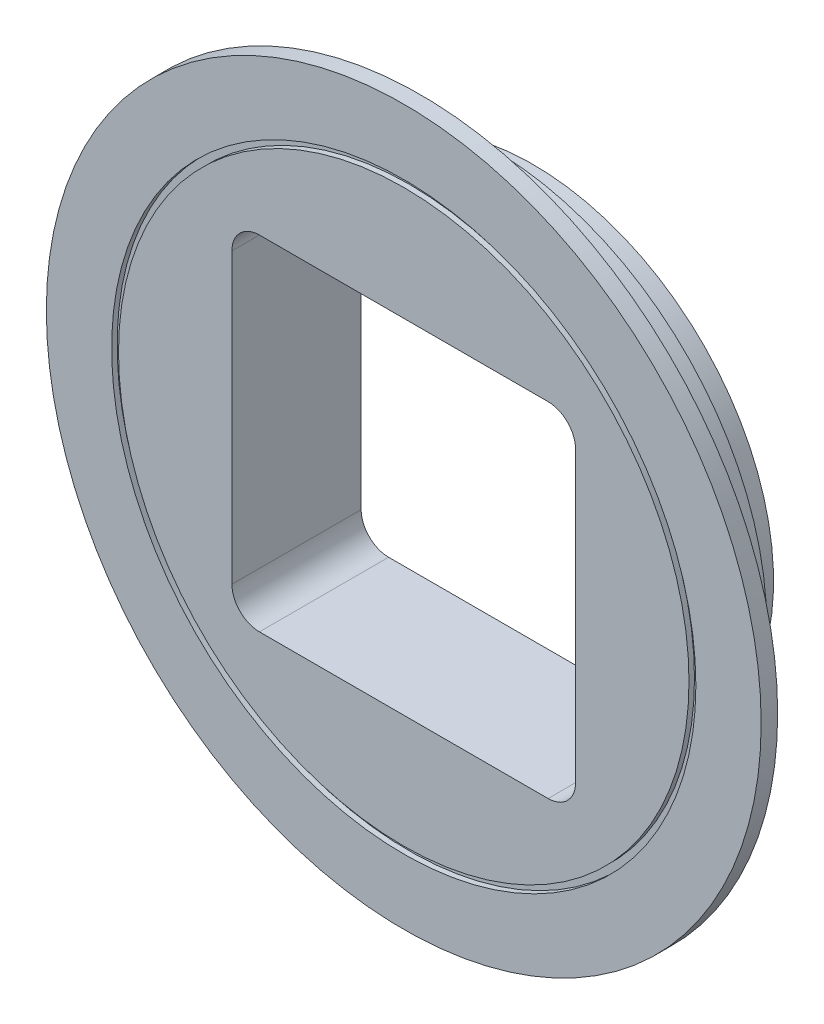
ISO-10303-21;
HEADER;
FILE_DESCRIPTION(('STEP AP214'),'2;1');
FILE_NAME('part.step','',(''),(''),'','','');
FILE_SCHEMA(('AUTOMOTIVE_DESIGN { 1 0 10303 214 1 1 1 1 }'));
ENDSEC;
DATA;
#1=APPLICATION_CONTEXT('core data for automotive mechanical design processes');
#2=APPLICATION_PROTOCOL_DEFINITION('international standard','automotive_design',2000,#1);
#3=PRODUCT_CONTEXT('',#1,'mechanical');
#4=PRODUCT('Part','Part','',(#3));
#5=PRODUCT_RELATED_PRODUCT_CATEGORY('part','',(#4));
#6=PRODUCT_DEFINITION_FORMATION('','',#4);
#7=PRODUCT_DEFINITION_CONTEXT('part definition',#1,'design');
#8=PRODUCT_DEFINITION('design','',#6,#7);
#9=PRODUCT_DEFINITION_SHAPE('','',#8);
#10=(LENGTH_UNIT() NAMED_UNIT(*) SI_UNIT(.MILLI.,.METRE.));
#11=(NAMED_UNIT(*) PLANE_ANGLE_UNIT() SI_UNIT($,.RADIAN.));
#12=(NAMED_UNIT(*) SI_UNIT($,.STERADIAN.) SOLID_ANGLE_UNIT());
#13=UNCERTAINTY_MEASURE_WITH_UNIT(LENGTH_MEASURE(1.E-05),#10,'distance_accuracy_value','');
#14=(GEOMETRIC_REPRESENTATION_CONTEXT(3) GLOBAL_UNCERTAINTY_ASSIGNED_CONTEXT((#13)) GLOBAL_UNIT_ASSIGNED_CONTEXT((#10,
#11,#12)) REPRESENTATION_CONTEXT('',''));
#15=CARTESIAN_POINT('',(0.,0.,0.));
#16=DIRECTION('',(0.,0.,1.));
#17=DIRECTION('',(1.,0.,0.));
#18=AXIS2_PLACEMENT_3D('',#15,#16,#17);
#19=CARTESIAN_POINT('',(0.,0.,7.4));
#20=DIRECTION('',(0.,0.,1.));
#21=DIRECTION('',(1.,0.,0.));
#22=AXIS2_PLACEMENT_3D('',#19,#20,#21);
#23=PLANE('',#22);
#24=DIRECTION('',(1.,0.,0.));
#25=VECTOR('',#24,1.);
#26=CARTESIAN_POINT('',(-10.5,-12.5,7.4));
#27=LINE('',#26,#25);
#28=CARTESIAN_POINT('',(-10.5,-12.5,7.4));
#29=VERTEX_POINT('',#28);
#30=CARTESIAN_POINT('',(10.5,-12.5,7.4));
#31=VERTEX_POINT('',#30);
#32=EDGE_CURVE('E115',#29,#31,#27,.T.);
#33=ORIENTED_EDGE('',*,*,#32,.F.);
#34=CARTESIAN_POINT('',(-10.5,-10.5,7.4));
#35=DIRECTION('',(0.,0.,1.));
#36=DIRECTION('',(1.,0.,0.));
#37=AXIS2_PLACEMENT_3D('',#34,#35,#36);
#38=CIRCLE('',#37,2.);
#39=CARTESIAN_POINT('',(-12.5,-10.5,7.4));
#40=VERTEX_POINT('',#39);
#41=EDGE_CURVE('E125',#40,#29,#38,.T.);
#42=ORIENTED_EDGE('',*,*,#41,.F.);
#43=DIRECTION('',(0.,-1.,0.));
#44=VECTOR('',#43,1.);
#45=CARTESIAN_POINT('',(-12.5,10.5,7.4));
#46=LINE('',#45,#44);
#47=CARTESIAN_POINT('',(-12.5,10.5,7.4));
#48=VERTEX_POINT('',#47);
#49=EDGE_CURVE('E150',#48,#40,#46,.T.);
#50=ORIENTED_EDGE('',*,*,#49,.F.);
#51=CARTESIAN_POINT('',(-10.5,10.5,7.4));
#52=DIRECTION('',(0.,0.,1.));
#53=DIRECTION('',(1.,0.,0.));
#54=AXIS2_PLACEMENT_3D('',#51,#52,#53);
#55=CIRCLE('',#54,2.);
#56=CARTESIAN_POINT('',(-10.5,12.5,7.4));
#57=VERTEX_POINT('',#56);
#58=EDGE_CURVE('E148',#57,#48,#55,.T.);
#59=ORIENTED_EDGE('',*,*,#58,.F.);
#60=DIRECTION('',(-1.,0.,0.));
#61=VECTOR('',#60,1.);
#62=CARTESIAN_POINT('',(10.5,12.5,7.4));
#63=LINE('',#62,#61);
#64=CARTESIAN_POINT('',(10.5,12.5,7.4));
#65=VERTEX_POINT('',#64);
#66=EDGE_CURVE('E145',#65,#57,#63,.T.);
#67=ORIENTED_EDGE('',*,*,#66,.F.);
#68=CARTESIAN_POINT('',(10.5,10.5,7.4));
#69=DIRECTION('',(0.,0.,1.));
#70=DIRECTION('',(1.,0.,0.));
#71=AXIS2_PLACEMENT_3D('',#68,#69,#70);
#72=CIRCLE('',#71,2.);
#73=CARTESIAN_POINT('',(12.5,10.5,7.4));
#74=VERTEX_POINT('',#73);
#75=EDGE_CURVE('E142',#74,#65,#72,.T.);
#76=ORIENTED_EDGE('',*,*,#75,.F.);
#77=DIRECTION('',(0.,1.,0.));
#78=VECTOR('',#77,1.);
#79=CARTESIAN_POINT('',(12.5,-10.5,7.4));
#80=LINE('',#79,#78);
#81=CARTESIAN_POINT('',(12.5,-10.5,7.4));
#82=VERTEX_POINT('',#81);
#83=EDGE_CURVE('E136',#82,#74,#80,.T.);
#84=ORIENTED_EDGE('',*,*,#83,.F.);
#85=CARTESIAN_POINT('',(10.5,-10.5,7.4));
#86=DIRECTION('',(0.,0.,1.));
#87=DIRECTION('',(1.,0.,0.));
#88=AXIS2_PLACEMENT_3D('',#85,#86,#87);
#89=CIRCLE('',#88,2.);
#90=EDGE_CURVE('E134',#31,#82,#89,.T.);
#91=ORIENTED_EDGE('',*,*,#90,.F.);
#92=EDGE_LOOP('',(#33,#42,#50,#59,#67,#76,#84,#91));
#93=FACE_BOUND('',#92,.T.);
#94=CARTESIAN_POINT('',(0.,0.,7.4));
#95=DIRECTION('',(0.,0.,1.));
#96=DIRECTION('',(1.,0.,0.));
#97=AXIS2_PLACEMENT_3D('',#94,#95,#96);
#98=CIRCLE('',#97,20.75);
#99=CARTESIAN_POINT('',(20.75,0.,7.4));
#100=VERTEX_POINT('',#99);
#101=EDGE_CURVE('E255',#100,#100,#98,.T.);
#102=ORIENTED_EDGE('',*,*,#101,.T.);
#103=EDGE_LOOP('',(#102));
#104=FACE_BOUND('',#103,.T.);
#105=ADVANCED_FACE('F43',(#93,#104),#23,.T.);
#106=CARTESIAN_POINT('',(0.,0.,7.001));
#107=DIRECTION('',(0.,0.,-1.));
#108=DIRECTION('',(-1.,0.,0.));
#109=AXIS2_PLACEMENT_3D('',#106,#107,#108);
#110=CYLINDRICAL_SURFACE('',#109,22.5);
#111=CARTESIAN_POINT('',(0.,0.,5.));
#112=DIRECTION('',(0.,0.,-1.));
#113=DIRECTION('',(-1.,0.,0.));
#114=AXIS2_PLACEMENT_3D('',#111,#112,#113);
#115=CIRCLE('',#114,22.5);
#116=CARTESIAN_POINT('',(-22.5,0.,5.));
#117=VERTEX_POINT('',#116);
#118=EDGE_CURVE('E158',#117,#117,#115,.T.);
#119=ORIENTED_EDGE('',*,*,#118,.F.);
#120=EDGE_LOOP('',(#119));
#121=FACE_BOUND('',#120,.T.);
#122=CARTESIAN_POINT('',(0.,0.,6.2));
#123=DIRECTION('',(0.,0.,1.));
#124=DIRECTION('',(1.,0.,0.));
#125=AXIS2_PLACEMENT_3D('',#122,#123,#124);
#126=CIRCLE('',#125,22.5);
#127=CARTESIAN_POINT('',(22.5,0.,6.2));
#128=VERTEX_POINT('',#127);
#129=EDGE_CURVE('E48',#128,#128,#126,.F.);
#130=ORIENTED_EDGE('',*,*,#129,.T.);
#131=EDGE_LOOP('',(#130));
#132=FACE_BOUND('',#131,.T.);
#133=ADVANCED_FACE('F221',(#121,#132),#110,.T.);
#134=CARTESIAN_POINT('',(0.,0.,5.));
#135=DIRECTION('',(0.,0.,1.));
#136=DIRECTION('',(1.,0.,0.));
#137=AXIS2_PLACEMENT_3D('',#134,#135,#136);
#138=PLANE('',#137);
#139=CARTESIAN_POINT('',(0.,0.,5.));
#140=DIRECTION('',(0.,0.,1.));
#141=DIRECTION('',(1.,0.,0.));
#142=AXIS2_PLACEMENT_3D('',#139,#140,#141);
#143=CIRCLE('',#142,20.);
#144=CARTESIAN_POINT('',(20.,0.,5.));
#145=VERTEX_POINT('',#144);
#146=EDGE_CURVE('E196',#145,#145,#143,.F.);
#147=ORIENTED_EDGE('',*,*,#146,.F.);
#148=EDGE_LOOP('',(#147));
#149=FACE_BOUND('',#148,.T.);
#150=ORIENTED_EDGE('',*,*,#118,.T.);
#151=EDGE_LOOP('',(#150));
#152=FACE_BOUND('',#151,.T.);
#153=ADVANCED_FACE('F229',(#149,#152),#138,.F.);
#154=CARTESIAN_POINT('',(-12.5,12.5,7.));
#155=DIRECTION('',(1.,0.,0.));
#156=DIRECTION('',(0.,1.,0.));
#157=AXIS2_PLACEMENT_3D('',#154,#155,#156);
#158=PLANE('',#157);
#159=DIRECTION('',(0.,0.,-1.));
#160=VECTOR('',#159,1.);
#161=CARTESIAN_POINT('',(-12.5,-10.5,5.));
#162=LINE('',#161,#160);
#163=CARTESIAN_POINT('',(-12.5,-10.5,-2.));
#164=VERTEX_POINT('',#163);
#165=EDGE_CURVE('E60',#40,#164,#162,.T.);
#166=ORIENTED_EDGE('',*,*,#165,.T.);
#167=DIRECTION('',(0.,1.,0.));
#168=VECTOR('',#167,1.);
#169=CARTESIAN_POINT('',(-12.5,10.5,-2.));
#170=LINE('',#169,#168);
#171=CARTESIAN_POINT('',(-12.5,10.5,-2.));
#172=VERTEX_POINT('',#171);
#173=EDGE_CURVE('E178',#164,#172,#170,.T.);
#174=ORIENTED_EDGE('',*,*,#173,.T.);
#175=DIRECTION('',(0.,0.,-1.));
#176=VECTOR('',#175,1.);
#177=CARTESIAN_POINT('',(-12.5,10.5,7.));
#178=LINE('',#177,#176);
#179=EDGE_CURVE('E68',#172,#48,#178,.F.);
#180=ORIENTED_EDGE('',*,*,#179,.T.);
#181=ORIENTED_EDGE('',*,*,#49,.T.);
#182=EDGE_LOOP('',(#166,#174,#180,#181));
#183=FACE_BOUND('',#182,.T.);
#184=ADVANCED_FACE('F375',(#183),#158,.T.);
#185=CARTESIAN_POINT('',(-12.5,-12.5,7.));
#186=DIRECTION('',(0.,1.,0.));
#187=DIRECTION('',(0.,0.,1.));
#188=AXIS2_PLACEMENT_3D('',#185,#186,#187);
#189=PLANE('',#188);
#190=DIRECTION('',(0.,0.,-1.));
#191=VECTOR('',#190,1.);
#192=CARTESIAN_POINT('',(10.5,-12.5,5.));
#193=LINE('',#192,#191);
#194=CARTESIAN_POINT('',(10.5,-12.5,-2.));
#195=VERTEX_POINT('',#194);
#196=EDGE_CURVE('E121',#31,#195,#193,.T.);
#197=ORIENTED_EDGE('',*,*,#196,.T.);
#198=DIRECTION('',(-1.,0.,0.));
#199=VECTOR('',#198,1.);
#200=CARTESIAN_POINT('',(-10.5,-12.5,-2.));
#201=LINE('',#200,#199);
#202=CARTESIAN_POINT('',(-10.5,-12.5,-2.));
#203=VERTEX_POINT('',#202);
#204=EDGE_CURVE('E118',#195,#203,#201,.T.);
#205=ORIENTED_EDGE('',*,*,#204,.T.);
#206=DIRECTION('',(0.,0.,-1.));
#207=VECTOR('',#206,1.);
#208=CARTESIAN_POINT('',(-10.5,-12.5,7.));
#209=LINE('',#208,#207);
#210=EDGE_CURVE('E111',#203,#29,#209,.F.);
#211=ORIENTED_EDGE('',*,*,#210,.T.);
#212=ORIENTED_EDGE('',*,*,#32,.T.);
#213=EDGE_LOOP('',(#197,#205,#211,#212));
#214=FACE_BOUND('',#213,.T.);
#215=ADVANCED_FACE('F113',(#214),#189,.T.);
#216=CARTESIAN_POINT('',(12.5,12.5,7.));
#217=DIRECTION('',(-1.,0.,0.));
#218=DIRECTION('',(0.,-1.,0.));
#219=AXIS2_PLACEMENT_3D('',#216,#217,#218);
#220=PLANE('',#219);
#221=DIRECTION('',(0.,0.,-1.));
#222=VECTOR('',#221,1.);
#223=CARTESIAN_POINT('',(12.5,10.5,5.));
#224=LINE('',#223,#222);
#225=CARTESIAN_POINT('',(12.5,10.5,-2.));
#226=VERTEX_POINT('',#225);
#227=EDGE_CURVE('E188',#74,#226,#224,.T.);
#228=ORIENTED_EDGE('',*,*,#227,.T.);
#229=DIRECTION('',(0.,-1.,0.));
#230=VECTOR('',#229,1.);
#231=CARTESIAN_POINT('',(12.5,-10.5,-2.));
#232=LINE('',#231,#230);
#233=CARTESIAN_POINT('',(12.5,-10.5,-2.));
#234=VERTEX_POINT('',#233);
#235=EDGE_CURVE('E169',#226,#234,#232,.T.);
#236=ORIENTED_EDGE('',*,*,#235,.T.);
#237=DIRECTION('',(0.,0.,-1.));
#238=VECTOR('',#237,1.);
#239=CARTESIAN_POINT('',(12.5,-10.5,7.));
#240=LINE('',#239,#238);
#241=EDGE_CURVE('E186',#234,#82,#240,.F.);
#242=ORIENTED_EDGE('',*,*,#241,.T.);
#243=ORIENTED_EDGE('',*,*,#83,.T.);
#244=EDGE_LOOP('',(#228,#236,#242,#243));
#245=FACE_BOUND('',#244,.T.);
#246=ADVANCED_FACE('F354',(#245),#220,.T.);
#247=CARTESIAN_POINT('',(-12.5,12.5,7.));
#248=DIRECTION('',(0.,-1.,0.));
#249=DIRECTION('',(1.,0.,0.));
#250=AXIS2_PLACEMENT_3D('',#247,#248,#249);
#251=PLANE('',#250);
#252=DIRECTION('',(0.,0.,-1.));
#253=VECTOR('',#252,1.);
#254=CARTESIAN_POINT('',(-10.5,12.5,5.));
#255=LINE('',#254,#253);
#256=CARTESIAN_POINT('',(-10.5,12.5,-2.));
#257=VERTEX_POINT('',#256);
#258=EDGE_CURVE('E190',#57,#257,#255,.T.);
#259=ORIENTED_EDGE('',*,*,#258,.T.);
#260=DIRECTION('',(1.,0.,0.));
#261=VECTOR('',#260,1.);
#262=CARTESIAN_POINT('',(10.5,12.5,-2.));
#263=LINE('',#262,#261);
#264=CARTESIAN_POINT('',(10.5,12.5,-2.));
#265=VERTEX_POINT('',#264);
#266=EDGE_CURVE('E163',#257,#265,#263,.T.);
#267=ORIENTED_EDGE('',*,*,#266,.T.);
#268=DIRECTION('',(0.,0.,-1.));
#269=VECTOR('',#268,1.);
#270=CARTESIAN_POINT('',(10.5,12.5,7.));
#271=LINE('',#270,#269);
#272=EDGE_CURVE('E122',#265,#65,#271,.F.);
#273=ORIENTED_EDGE('',*,*,#272,.T.);
#274=ORIENTED_EDGE('',*,*,#66,.T.);
#275=EDGE_LOOP('',(#259,#267,#273,#274));
#276=FACE_BOUND('',#275,.T.);
#277=ADVANCED_FACE('F343',(#276),#251,.T.);
#278=CARTESIAN_POINT('',(10.5,10.5,7.));
#279=DIRECTION('',(0.,0.,1.));
#280=DIRECTION('',(1.,0.,0.));
#281=AXIS2_PLACEMENT_3D('',#278,#279,#280);
#282=CYLINDRICAL_SURFACE('',#281,2.);
#283=ORIENTED_EDGE('',*,*,#75,.T.);
#284=ORIENTED_EDGE('',*,*,#272,.F.);
#285=CARTESIAN_POINT('',(10.5,10.5,-2.));
#286=DIRECTION('',(0.,0.,-1.));
#287=DIRECTION('',(-1.,0.,0.));
#288=AXIS2_PLACEMENT_3D('',#285,#286,#287);
#289=CIRCLE('',#288,2.);
#290=EDGE_CURVE('E166',#265,#226,#289,.T.);
#291=ORIENTED_EDGE('',*,*,#290,.T.);
#292=ORIENTED_EDGE('',*,*,#227,.F.);
#293=EDGE_LOOP('',(#283,#284,#291,#292));
#294=FACE_BOUND('',#293,.T.);
#295=ADVANCED_FACE('F332',(#294),#282,.F.);
#296=CARTESIAN_POINT('',(10.5,-10.5,7.));
#297=DIRECTION('',(0.,0.,1.));
#298=DIRECTION('',(1.,0.,0.));
#299=AXIS2_PLACEMENT_3D('',#296,#297,#298);
#300=CYLINDRICAL_SURFACE('',#299,2.);
#301=ORIENTED_EDGE('',*,*,#90,.T.);
#302=ORIENTED_EDGE('',*,*,#241,.F.);
#303=CARTESIAN_POINT('',(10.5,-10.5,-2.));
#304=DIRECTION('',(0.,0.,-1.));
#305=DIRECTION('',(-1.,0.,0.));
#306=AXIS2_PLACEMENT_3D('',#303,#304,#305);
#307=CIRCLE('',#306,2.);
#308=EDGE_CURVE('E172',#234,#195,#307,.T.);
#309=ORIENTED_EDGE('',*,*,#308,.T.);
#310=ORIENTED_EDGE('',*,*,#196,.F.);
#311=EDGE_LOOP('',(#301,#302,#309,#310));
#312=FACE_BOUND('',#311,.T.);
#313=ADVANCED_FACE('F322',(#312),#300,.F.);
#314=CARTESIAN_POINT('',(-10.5,-10.5,7.));
#315=DIRECTION('',(0.,0.,1.));
#316=DIRECTION('',(1.,0.,0.));
#317=AXIS2_PLACEMENT_3D('',#314,#315,#316);
#318=CYLINDRICAL_SURFACE('',#317,2.);
#319=ORIENTED_EDGE('',*,*,#41,.T.);
#320=ORIENTED_EDGE('',*,*,#210,.F.);
#321=CARTESIAN_POINT('',(-10.5,-10.5,-2.));
#322=DIRECTION('',(0.,0.,-1.));
#323=DIRECTION('',(-1.,0.,0.));
#324=AXIS2_PLACEMENT_3D('',#321,#322,#323);
#325=CIRCLE('',#324,2.);
#326=EDGE_CURVE('E176',#203,#164,#325,.T.);
#327=ORIENTED_EDGE('',*,*,#326,.T.);
#328=ORIENTED_EDGE('',*,*,#165,.F.);
#329=EDGE_LOOP('',(#319,#320,#327,#328));
#330=FACE_BOUND('',#329,.T.);
#331=ADVANCED_FACE('F126',(#330),#318,.F.);
#332=CARTESIAN_POINT('',(-10.5,10.5,7.));
#333=DIRECTION('',(0.,0.,1.));
#334=DIRECTION('',(1.,0.,0.));
#335=AXIS2_PLACEMENT_3D('',#332,#333,#334);
#336=CYLINDRICAL_SURFACE('',#335,2.);
#337=ORIENTED_EDGE('',*,*,#58,.T.);
#338=ORIENTED_EDGE('',*,*,#179,.F.);
#339=CARTESIAN_POINT('',(-10.5,10.5,-2.));
#340=DIRECTION('',(0.,0.,-1.));
#341=DIRECTION('',(-1.,0.,0.));
#342=AXIS2_PLACEMENT_3D('',#339,#340,#341);
#343=CIRCLE('',#342,2.);
#344=EDGE_CURVE('E161',#172,#257,#343,.T.);
#345=ORIENTED_EDGE('',*,*,#344,.T.);
#346=ORIENTED_EDGE('',*,*,#258,.F.);
#347=EDGE_LOOP('',(#337,#338,#345,#346));
#348=FACE_BOUND('',#347,.T.);
#349=ADVANCED_FACE('F310',(#348),#336,.F.);
#350=CARTESIAN_POINT('',(0.,0.,1.));
#351=DIRECTION('',(0.,0.,-1.));
#352=DIRECTION('',(-1.,0.,0.));
#353=AXIS2_PLACEMENT_3D('',#350,#351,#352);
#354=PLANE('',#353);
#355=CARTESIAN_POINT('',(0.,0.,1.));
#356=DIRECTION('',(0.,0.,-1.));
#357=DIRECTION('',(-1.,0.,0.));
#358=AXIS2_PLACEMENT_3D('',#355,#356,#357);
#359=CIRCLE('',#358,18.5);
#360=CARTESIAN_POINT('',(-18.5,0.,1.));
#361=VERTEX_POINT('',#360);
#362=EDGE_CURVE('E11',#361,#361,#359,.F.);
#363=ORIENTED_EDGE('',*,*,#362,.T.);
#364=EDGE_LOOP('',(#363));
#365=FACE_BOUND('',#364,.T.);
#366=CARTESIAN_POINT('',(0.,0.,1.));
#367=DIRECTION('',(0.,0.,-1.));
#368=DIRECTION('',(-1.,0.,0.));
#369=AXIS2_PLACEMENT_3D('',#366,#367,#368);
#370=CIRCLE('',#369,20.);
#371=CARTESIAN_POINT('',(-20.,0.,1.));
#372=VERTEX_POINT('',#371);
#373=EDGE_CURVE('E183',#372,#372,#370,.T.);
#374=ORIENTED_EDGE('',*,*,#373,.T.);
#375=EDGE_LOOP('',(#374));
#376=FACE_BOUND('',#375,.T.);
#377=ADVANCED_FACE('F313',(#365,#376),#354,.T.);
#378=CARTESIAN_POINT('',(0.,0.,1.));
#379=DIRECTION('',(0.,0.,1.));
#380=DIRECTION('',(1.,0.,0.));
#381=AXIS2_PLACEMENT_3D('',#378,#379,#380);
#382=CYLINDRICAL_SURFACE('',#381,20.);
#383=ORIENTED_EDGE('',*,*,#373,.F.);
#384=EDGE_LOOP('',(#383));
#385=FACE_BOUND('',#384,.T.);
#386=ORIENTED_EDGE('',*,*,#146,.T.);
#387=EDGE_LOOP('',(#386));
#388=FACE_BOUND('',#387,.T.);
#389=ADVANCED_FACE('F412',(#385,#388),#382,.T.);
#390=CARTESIAN_POINT('',(0.,0.,-2.));
#391=DIRECTION('',(0.,0.,-1.));
#392=DIRECTION('',(-1.,0.,0.));
#393=AXIS2_PLACEMENT_3D('',#390,#391,#392);
#394=PLANE('',#393);
#395=CARTESIAN_POINT('',(0.,0.,-2.));
#396=DIRECTION('',(0.,0.,-1.));
#397=DIRECTION('',(-1.,0.,0.));
#398=AXIS2_PLACEMENT_3D('',#395,#396,#397);
#399=CIRCLE('',#398,17.5);
#400=CARTESIAN_POINT('',(-17.5,0.,-2.));
#401=VERTEX_POINT('',#400);
#402=EDGE_CURVE('E180',#401,#401,#399,.T.);
#403=ORIENTED_EDGE('',*,*,#402,.T.);
#404=EDGE_LOOP('',(#403));
#405=FACE_BOUND('',#404,.T.);
#406=ORIENTED_EDGE('',*,*,#266,.F.);
#407=ORIENTED_EDGE('',*,*,#344,.F.);
#408=ORIENTED_EDGE('',*,*,#173,.F.);
#409=ORIENTED_EDGE('',*,*,#326,.F.);
#410=ORIENTED_EDGE('',*,*,#204,.F.);
#411=ORIENTED_EDGE('',*,*,#308,.F.);
#412=ORIENTED_EDGE('',*,*,#235,.F.);
#413=ORIENTED_EDGE('',*,*,#290,.F.);
#414=EDGE_LOOP('',(#406,#407,#408,#409,#410,#411,#412,#413));
#415=FACE_BOUND('',#414,.T.);
#416=ADVANCED_FACE('F217',(#405,#415),#394,.T.);
#417=CARTESIAN_POINT('',(0.,0.,-2.));
#418=DIRECTION('',(0.,0.,1.));
#419=DIRECTION('',(1.,0.,0.));
#420=AXIS2_PLACEMENT_3D('',#417,#418,#419);
#421=CYLINDRICAL_SURFACE('',#420,17.5);
#422=CARTESIAN_POINT('',(0.,0.,0.));
#423=DIRECTION('',(0.,0.,-1.));
#424=DIRECTION('',(-1.,0.,0.));
#425=AXIS2_PLACEMENT_3D('',#422,#423,#424);
#426=CIRCLE('',#425,17.5);
#427=CARTESIAN_POINT('',(-17.5,0.,0.));
#428=VERTEX_POINT('',#427);
#429=EDGE_CURVE('E53',#428,#428,#426,.T.);
#430=ORIENTED_EDGE('',*,*,#429,.T.);
#431=EDGE_LOOP('',(#430));
#432=FACE_BOUND('',#431,.T.);
#433=ORIENTED_EDGE('',*,*,#402,.F.);
#434=EDGE_LOOP('',(#433));
#435=FACE_BOUND('',#434,.T.);
#436=ADVANCED_FACE('F202',(#432,#435),#421,.T.);
#437=CARTESIAN_POINT('',(0.,0.,0.));
#438=DIRECTION('',(0.,0.,1.));
#439=DIRECTION('',(1.,0.,0.));
#440=AXIS2_PLACEMENT_3D('',#437,#438,#439);
#441=CONICAL_SURFACE('',#440,17.5,0.785398163397441);
#442=ORIENTED_EDGE('',*,*,#362,.F.);
#443=EDGE_LOOP('',(#442));
#444=FACE_BOUND('',#443,.T.);
#445=ORIENTED_EDGE('',*,*,#429,.F.);
#446=EDGE_LOOP('',(#445));
#447=FACE_BOUND('',#446,.T.);
#448=ADVANCED_FACE('F46',(#444,#447),#441,.T.);
#449=CARTESIAN_POINT('',(0.,0.,6.2));
#450=DIRECTION('',(0.,0.,1.));
#451=DIRECTION('',(1.,0.,0.));
#452=AXIS2_PLACEMENT_3D('',#449,#450,#451);
#453=CYLINDRICAL_SURFACE('',#452,26.);
#454=CARTESIAN_POINT('',(0.,0.,6.2));
#455=DIRECTION('',(0.,0.,1.));
#456=DIRECTION('',(1.,0.,0.));
#457=AXIS2_PLACEMENT_3D('',#454,#455,#456);
#458=CIRCLE('',#457,26.);
#459=CARTESIAN_POINT('',(26.,0.,6.2));
#460=VERTEX_POINT('',#459);
#461=EDGE_CURVE('E155',#460,#460,#458,.T.);
#462=ORIENTED_EDGE('',*,*,#461,.T.);
#463=EDGE_LOOP('',(#462));
#464=FACE_BOUND('',#463,.T.);
#465=CARTESIAN_POINT('',(0.,0.,7.4));
#466=DIRECTION('',(0.,0.,1.));
#467=DIRECTION('',(1.,0.,0.));
#468=AXIS2_PLACEMENT_3D('',#465,#466,#467);
#469=CIRCLE('',#468,26.);
#470=CARTESIAN_POINT('',(26.,0.,7.4));
#471=VERTEX_POINT('',#470);
#472=EDGE_CURVE('E152',#471,#471,#469,.T.);
#473=ORIENTED_EDGE('',*,*,#472,.F.);
#474=EDGE_LOOP('',(#473));
#475=FACE_BOUND('',#474,.T.);
#476=ADVANCED_FACE('F206',(#464,#475),#453,.T.);
#477=CARTESIAN_POINT('',(0.,0.,6.2));
#478=DIRECTION('',(0.,0.,1.));
#479=DIRECTION('',(1.,0.,0.));
#480=AXIS2_PLACEMENT_3D('',#477,#478,#479);
#481=PLANE('',#480);
#482=ORIENTED_EDGE('',*,*,#129,.F.);
#483=EDGE_LOOP('',(#482));
#484=FACE_BOUND('',#483,.T.);
#485=ORIENTED_EDGE('',*,*,#461,.F.);
#486=EDGE_LOOP('',(#485));
#487=FACE_BOUND('',#486,.T.);
#488=ADVANCED_FACE('F213',(#484,#487),#481,.F.);
#489=CARTESIAN_POINT('',(0.,0.,7.4));
#490=DIRECTION('',(0.,0.,1.));
#491=DIRECTION('',(1.,0.,0.));
#492=AXIS2_PLACEMENT_3D('',#489,#490,#491);
#493=CIRCLE('',#492,21.25);
#494=CARTESIAN_POINT('',(21.25,0.,7.4));
#495=VERTEX_POINT('',#494);
#496=EDGE_CURVE('E247',#495,#495,#493,.T.);
#497=ORIENTED_EDGE('',*,*,#496,.F.);
#498=EDGE_LOOP('',(#497));
#499=FACE_BOUND('',#498,.T.);
#500=ORIENTED_EDGE('',*,*,#472,.T.);
#501=EDGE_LOOP('',(#500));
#502=FACE_BOUND('',#501,.T.);
#503=ADVANCED_FACE('F223',(#499,#502),#23,.T.);
#504=CARTESIAN_POINT('',(0.,0.,7.));
#505=DIRECTION('',(0.,0.,1.));
#506=DIRECTION('',(1.,0.,0.));
#507=AXIS2_PLACEMENT_3D('',#504,#505,#506);
#508=CYLINDRICAL_SURFACE('',#507,21.25);
#509=CARTESIAN_POINT('',(0.,0.,7.));
#510=DIRECTION('',(0.,0.,1.));
#511=DIRECTION('',(1.,0.,0.));
#512=AXIS2_PLACEMENT_3D('',#509,#510,#511);
#513=CIRCLE('',#512,21.25);
#514=CARTESIAN_POINT('',(21.25,0.,7.));
#515=VERTEX_POINT('',#514);
#516=EDGE_CURVE('E129',#515,#515,#513,.T.);
#517=ORIENTED_EDGE('',*,*,#516,.F.);
#518=EDGE_LOOP('',(#517));
#519=FACE_BOUND('',#518,.T.);
#520=ORIENTED_EDGE('',*,*,#496,.T.);
#521=EDGE_LOOP('',(#520));
#522=FACE_BOUND('',#521,.T.);
#523=ADVANCED_FACE('F235',(#519,#522),#508,.F.);
#524=CARTESIAN_POINT('',(0.,0.,7.));
#525=DIRECTION('',(0.,0.,1.));
#526=DIRECTION('',(1.,0.,0.));
#527=AXIS2_PLACEMENT_3D('',#524,#525,#526);
#528=PLANE('',#527);
#529=CARTESIAN_POINT('',(0.,0.,7.));
#530=DIRECTION('',(0.,0.,1.));
#531=DIRECTION('',(1.,0.,0.));
#532=AXIS2_PLACEMENT_3D('',#529,#530,#531);
#533=CIRCLE('',#532,20.75);
#534=CARTESIAN_POINT('',(20.75,0.,7.));
#535=VERTEX_POINT('',#534);
#536=EDGE_CURVE('E251',#535,#535,#533,.T.);
#537=ORIENTED_EDGE('',*,*,#536,.F.);
#538=EDGE_LOOP('',(#537));
#539=FACE_BOUND('',#538,.T.);
#540=ORIENTED_EDGE('',*,*,#516,.T.);
#541=EDGE_LOOP('',(#540));
#542=FACE_BOUND('',#541,.T.);
#543=ADVANCED_FACE('F241',(#539,#542),#528,.T.);
#544=CARTESIAN_POINT('',(0.,0.,7.));
#545=DIRECTION('',(0.,0.,1.));
#546=DIRECTION('',(1.,0.,0.));
#547=AXIS2_PLACEMENT_3D('',#544,#545,#546);
#548=CYLINDRICAL_SURFACE('',#547,20.75);
#549=ORIENTED_EDGE('',*,*,#536,.T.);
#550=EDGE_LOOP('',(#549));
#551=FACE_BOUND('',#550,.T.);
#552=ORIENTED_EDGE('',*,*,#101,.F.);
#553=EDGE_LOOP('',(#552));
#554=FACE_BOUND('',#553,.T.);
#555=ADVANCED_FACE('F261',(#551,#554),#548,.T.);
#556=CLOSED_SHELL('',(#105,#133,#153,#184,#215,#246,#277,#295,#313,#331,#349,#377,#389,#416,
#436,#448,#476,#488,#503,#523,#543,#555));
#557=MANIFOLD_SOLID_BREP('B2',#556);
#558=ADVANCED_BREP_SHAPE_REPRESENTATION('',(#18,#557),#14);
#559=SHAPE_DEFINITION_REPRESENTATION(#9,#558);
ENDSEC;
END-ISO-10303-21;
